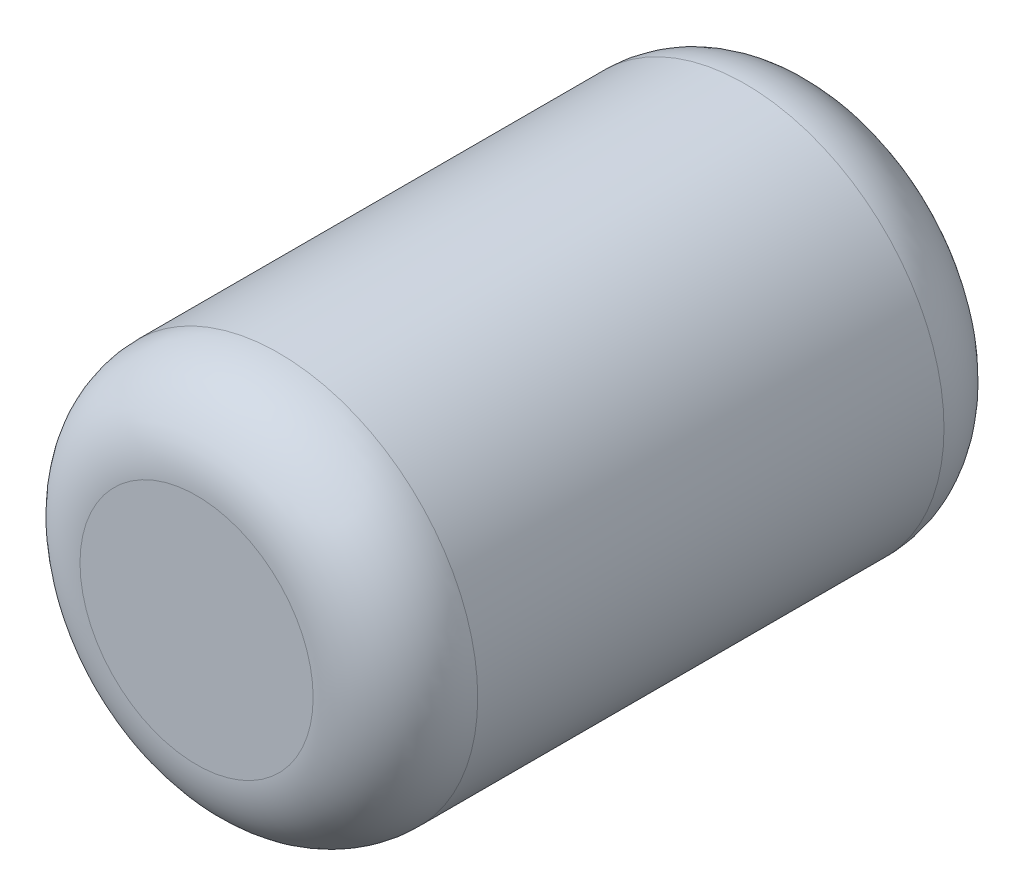
ISO-10303-21;
HEADER;
FILE_DESCRIPTION(('STEP AP214'),'2;1');
FILE_NAME('part.step','',(''),(''),'','','');
FILE_SCHEMA(('AUTOMOTIVE_DESIGN { 1 0 10303 214 1 1 1 1 }'));
ENDSEC;
DATA;
#1=APPLICATION_CONTEXT('core data for automotive mechanical design processes');
#2=APPLICATION_PROTOCOL_DEFINITION('international standard','automotive_design',2000,#1);
#3=PRODUCT_CONTEXT('',#1,'mechanical');
#4=PRODUCT('Part','Part','',(#3));
#5=PRODUCT_RELATED_PRODUCT_CATEGORY('part','',(#4));
#6=PRODUCT_DEFINITION_FORMATION('','',#4);
#7=PRODUCT_DEFINITION_CONTEXT('part definition',#1,'design');
#8=PRODUCT_DEFINITION('design','',#6,#7);
#9=PRODUCT_DEFINITION_SHAPE('','',#8);
#10=(LENGTH_UNIT() NAMED_UNIT(*) SI_UNIT(.MILLI.,.METRE.));
#11=(NAMED_UNIT(*) PLANE_ANGLE_UNIT() SI_UNIT($,.RADIAN.));
#12=(NAMED_UNIT(*) SI_UNIT($,.STERADIAN.) SOLID_ANGLE_UNIT());
#13=UNCERTAINTY_MEASURE_WITH_UNIT(LENGTH_MEASURE(1.E-05),#10,'distance_accuracy_value','');
#14=(GEOMETRIC_REPRESENTATION_CONTEXT(3) GLOBAL_UNCERTAINTY_ASSIGNED_CONTEXT((#13)) GLOBAL_UNIT_ASSIGNED_CONTEXT((#10,
#11,#12)) REPRESENTATION_CONTEXT('',''));
#15=CARTESIAN_POINT('',(0.,0.,0.));
#16=DIRECTION('',(0.,0.,1.));
#17=DIRECTION('',(1.,0.,0.));
#18=AXIS2_PLACEMENT_3D('',#15,#16,#17);
#19=CARTESIAN_POINT('',(0.,0.,23.));
#20=DIRECTION('',(0.,0.,-1.));
#21=DIRECTION('',(-1.,0.,0.));
#22=AXIS2_PLACEMENT_3D('',#19,#20,#21);
#23=CYLINDRICAL_SURFACE('',#22,7.25);
#24=CARTESIAN_POINT('',(0.,0.,20.));
#25=DIRECTION('',(0.,0.,1.));
#26=DIRECTION('',(1.,0.,0.));
#27=AXIS2_PLACEMENT_3D('',#24,#25,#26);
#28=CIRCLE('',#27,7.25);
#29=CARTESIAN_POINT('',(7.25,0.,20.));
#30=VERTEX_POINT('',#29);
#31=EDGE_CURVE('E47',#30,#30,#28,.F.);
#32=ORIENTED_EDGE('',*,*,#31,.T.);
#33=EDGE_LOOP('',(#32));
#34=FACE_BOUND('',#33,.T.);
#35=CARTESIAN_POINT('',(0.,0.,3.));
#36=DIRECTION('',(0.,0.,1.));
#37=DIRECTION('',(1.,0.,0.));
#38=AXIS2_PLACEMENT_3D('',#35,#36,#37);
#39=CIRCLE('',#38,7.25);
#40=CARTESIAN_POINT('',(7.25,0.,3.));
#41=VERTEX_POINT('',#40);
#42=EDGE_CURVE('E53',#41,#41,#39,.T.);
#43=ORIENTED_EDGE('',*,*,#42,.T.);
#44=EDGE_LOOP('',(#43));
#45=FACE_BOUND('',#44,.T.);
#46=ADVANCED_FACE('F39',(#34,#45),#23,.T.);
#47=CARTESIAN_POINT('',(0.,0.,23.));
#48=DIRECTION('',(0.,0.,1.));
#49=DIRECTION('',(1.,0.,0.));
#50=AXIS2_PLACEMENT_3D('',#47,#48,#49);
#51=PLANE('',#50);
#52=CARTESIAN_POINT('',(0.,0.,23.));
#53=DIRECTION('',(0.,0.,1.));
#54=DIRECTION('',(1.,0.,0.));
#55=AXIS2_PLACEMENT_3D('',#52,#53,#54);
#56=CIRCLE('',#55,4.25);
#57=CARTESIAN_POINT('',(4.25,0.,23.));
#58=VERTEX_POINT('',#57);
#59=EDGE_CURVE('E58',#58,#58,#56,.T.);
#60=ORIENTED_EDGE('',*,*,#59,.T.);
#61=EDGE_LOOP('',(#60));
#62=FACE_BOUND('',#61,.T.);
#63=ADVANCED_FACE('F64',(#62),#51,.T.);
#64=CARTESIAN_POINT('',(0.,0.,0.));
#65=DIRECTION('',(0.,0.,1.));
#66=DIRECTION('',(1.,0.,0.));
#67=AXIS2_PLACEMENT_3D('',#64,#65,#66);
#68=PLANE('',#67);
#69=CARTESIAN_POINT('',(0.,0.,0.));
#70=DIRECTION('',(0.,0.,1.));
#71=DIRECTION('',(1.,0.,0.));
#72=AXIS2_PLACEMENT_3D('',#69,#70,#71);
#73=CIRCLE('',#72,4.25);
#74=CARTESIAN_POINT('',(4.25,0.,0.));
#75=VERTEX_POINT('',#74);
#76=EDGE_CURVE('E10',#75,#75,#73,.F.);
#77=ORIENTED_EDGE('',*,*,#76,.T.);
#78=EDGE_LOOP('',(#77));
#79=FACE_BOUND('',#78,.T.);
#80=ADVANCED_FACE('F68',(#79),#68,.F.);
#81=CARTESIAN_POINT('',(0.,0.,20.));
#82=DIRECTION('',(0.,0.,1.));
#83=DIRECTION('',(1.,0.,0.));
#84=AXIS2_PLACEMENT_3D('',#81,#82,#83);
#85=TOROIDAL_SURFACE('',#84,4.25,3.);
#86=ORIENTED_EDGE('',*,*,#31,.F.);
#87=EDGE_LOOP('',(#86));
#88=FACE_BOUND('',#87,.T.);
#89=ORIENTED_EDGE('',*,*,#59,.F.);
#90=EDGE_LOOP('',(#89));
#91=FACE_BOUND('',#90,.T.);
#92=ADVANCED_FACE('F66',(#88,#91),#85,.T.);
#93=CARTESIAN_POINT('',(0.,0.,3.));
#94=DIRECTION('',(0.,0.,1.));
#95=DIRECTION('',(1.,0.,0.));
#96=AXIS2_PLACEMENT_3D('',#93,#94,#95);
#97=TOROIDAL_SURFACE('',#96,4.25,3.);
#98=ORIENTED_EDGE('',*,*,#76,.F.);
#99=EDGE_LOOP('',(#98));
#100=FACE_BOUND('',#99,.T.);
#101=ORIENTED_EDGE('',*,*,#42,.F.);
#102=EDGE_LOOP('',(#101));
#103=FACE_BOUND('',#102,.T.);
#104=ADVANCED_FACE('F41',(#100,#103),#97,.T.);
#105=CLOSED_SHELL('',(#46,#63,#80,#92,#104));
#106=MANIFOLD_SOLID_BREP('B2',#105);
#107=ADVANCED_BREP_SHAPE_REPRESENTATION('',(#18,#106),#14);
#108=SHAPE_DEFINITION_REPRESENTATION(#9,#107);
ENDSEC;
END-ISO-10303-21;
